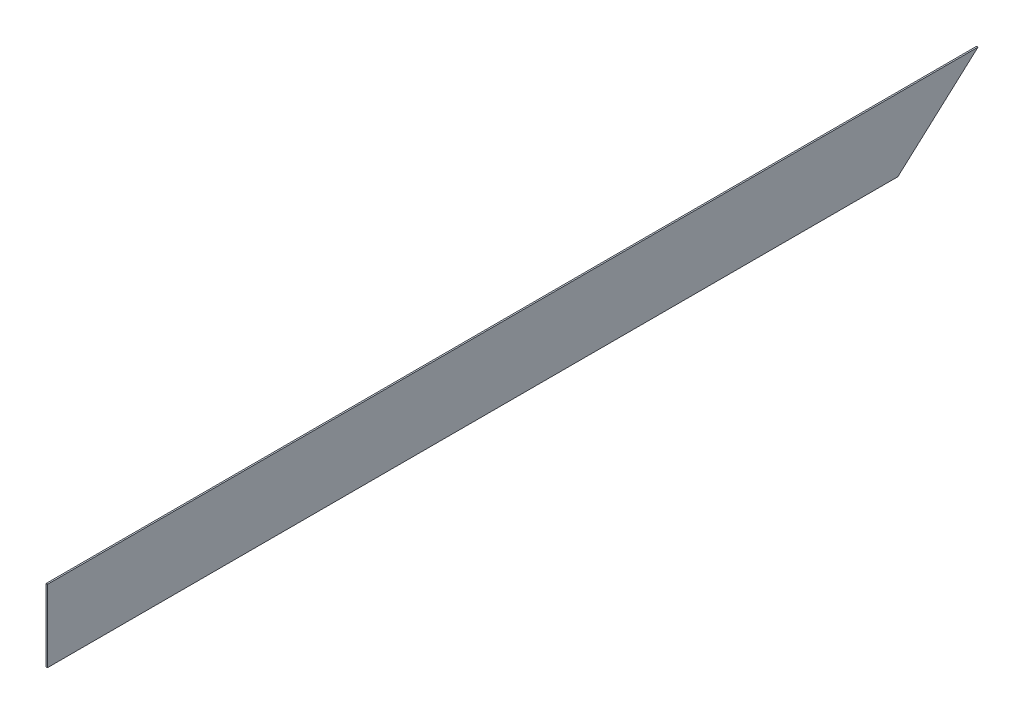
ISO-10303-21;
HEADER;
FILE_DESCRIPTION(('STEP AP214'),'2;1');
FILE_NAME('part.step','',(''),(''),'','','');
FILE_SCHEMA(('AUTOMOTIVE_DESIGN { 1 0 10303 214 1 1 1 1 }'));
ENDSEC;
DATA;
#1=APPLICATION_CONTEXT('core data for automotive mechanical design processes');
#2=APPLICATION_PROTOCOL_DEFINITION('international standard','automotive_design',2000,#1);
#3=PRODUCT_CONTEXT('',#1,'mechanical');
#4=PRODUCT('Part','Part','',(#3));
#5=PRODUCT_RELATED_PRODUCT_CATEGORY('part','',(#4));
#6=PRODUCT_DEFINITION_FORMATION('','',#4);
#7=PRODUCT_DEFINITION_CONTEXT('part definition',#1,'design');
#8=PRODUCT_DEFINITION('design','',#6,#7);
#9=PRODUCT_DEFINITION_SHAPE('','',#8);
#10=(LENGTH_UNIT() NAMED_UNIT(*) SI_UNIT(.MILLI.,.METRE.));
#11=(NAMED_UNIT(*) PLANE_ANGLE_UNIT() SI_UNIT($,.RADIAN.));
#12=(NAMED_UNIT(*) SI_UNIT($,.STERADIAN.) SOLID_ANGLE_UNIT());
#13=UNCERTAINTY_MEASURE_WITH_UNIT(LENGTH_MEASURE(1.E-05),#10,'distance_accuracy_value','');
#14=(GEOMETRIC_REPRESENTATION_CONTEXT(3) GLOBAL_UNCERTAINTY_ASSIGNED_CONTEXT((#13)) GLOBAL_UNIT_ASSIGNED_CONTEXT((#10,
#11,#12)) REPRESENTATION_CONTEXT('',''));
#15=CARTESIAN_POINT('',(0.,0.,0.));
#16=DIRECTION('',(0.,0.,1.));
#17=DIRECTION('',(1.,0.,0.));
#18=AXIS2_PLACEMENT_3D('',#15,#16,#17);
#19=CARTESIAN_POINT('',(669.,-986.,1896.));
#20=DIRECTION('',(-1.,0.,0.));
#21=DIRECTION('',(0.,0.,-1.));
#22=AXIS2_PLACEMENT_3D('',#19,#20,#21);
#23=PLANE('',#22);
#24=DIRECTION('',(0.,1.,0.));
#25=VECTOR('',#24,1.);
#26=CARTESIAN_POINT('',(669.,-1084.5,1896.));
#27=LINE('',#26,#25);
#28=CARTESIAN_POINT('',(669.,-1084.5,1896.));
#29=VERTEX_POINT('',#28);
#30=CARTESIAN_POINT('',(669.,-986.,1896.));
#31=VERTEX_POINT('',#30);
#32=EDGE_CURVE('E82',#29,#31,#27,.T.);
#33=ORIENTED_EDGE('',*,*,#32,.F.);
#34=DIRECTION('',(0.,0.,1.));
#35=VECTOR('',#34,1.);
#36=CARTESIAN_POINT('',(669.,-1084.5,736.));
#37=LINE('',#36,#35);
#38=CARTESIAN_POINT('',(669.,-1084.5,736.));
#39=VERTEX_POINT('',#38);
#40=EDGE_CURVE('E34',#39,#29,#37,.T.);
#41=ORIENTED_EDGE('',*,*,#40,.F.);
#42=DIRECTION('',(0.,-0.669130606358878,0.743144825477376));
#43=VECTOR('',#42,1.);
#44=CARTESIAN_POINT('',(669.,-986.,626.604667289));
#45=LINE('',#44,#43);
#46=CARTESIAN_POINT('',(669.,-986.,626.604667289));
#47=VERTEX_POINT('',#46);
#48=EDGE_CURVE('E43',#47,#39,#45,.T.);
#49=ORIENTED_EDGE('',*,*,#48,.F.);
#50=DIRECTION('',(0.,0.,-1.));
#51=VECTOR('',#50,1.);
#52=CARTESIAN_POINT('',(669.,-986.,1896.));
#53=LINE('',#52,#51);
#54=EDGE_CURVE('E26',#31,#47,#53,.T.);
#55=ORIENTED_EDGE('',*,*,#54,.F.);
#56=EDGE_LOOP('',(#33,#41,#49,#55));
#57=FACE_BOUND('',#56,.T.);
#58=ADVANCED_FACE('F17',(#57),#23,.F.);
#59=CARTESIAN_POINT('',(669.,-986.,1896.));
#60=DIRECTION('',(0.,1.,0.));
#61=DIRECTION('',(1.,0.,0.));
#62=AXIS2_PLACEMENT_3D('',#59,#60,#61);
#63=PLANE('',#62);
#64=DIRECTION('',(-1.,0.,0.));
#65=VECTOR('',#64,1.);
#66=CARTESIAN_POINT('',(669.,-986.,626.604667289));
#67=LINE('',#66,#65);
#68=CARTESIAN_POINT('',(667.,-986.,626.604667289));
#69=VERTEX_POINT('',#68);
#70=EDGE_CURVE('E11',#47,#69,#67,.T.);
#71=ORIENTED_EDGE('',*,*,#70,.T.);
#72=DIRECTION('',(0.,0.,-1.));
#73=VECTOR('',#72,1.);
#74=CARTESIAN_POINT('',(667.,-986.,1896.));
#75=LINE('',#74,#73);
#76=CARTESIAN_POINT('',(667.,-986.,1896.));
#77=VERTEX_POINT('',#76);
#78=EDGE_CURVE('E72',#77,#69,#75,.T.);
#79=ORIENTED_EDGE('',*,*,#78,.F.);
#80=DIRECTION('',(-1.,0.,0.));
#81=VECTOR('',#80,1.);
#82=CARTESIAN_POINT('',(669.,-986.,1896.));
#83=LINE('',#82,#81);
#84=EDGE_CURVE('E80',#31,#77,#83,.T.);
#85=ORIENTED_EDGE('',*,*,#84,.F.);
#86=ORIENTED_EDGE('',*,*,#54,.T.);
#87=EDGE_LOOP('',(#71,#79,#85,#86));
#88=FACE_BOUND('',#87,.T.);
#89=ADVANCED_FACE('F90',(#88),#63,.T.);
#90=CARTESIAN_POINT('',(669.,-1084.5,1896.));
#91=DIRECTION('',(0.,0.,1.));
#92=DIRECTION('',(-1.,0.,0.));
#93=AXIS2_PLACEMENT_3D('',#90,#91,#92);
#94=PLANE('',#93);
#95=ORIENTED_EDGE('',*,*,#84,.T.);
#96=DIRECTION('',(0.,1.,0.));
#97=VECTOR('',#96,1.);
#98=CARTESIAN_POINT('',(667.,-1084.5,1896.));
#99=LINE('',#98,#97);
#100=CARTESIAN_POINT('',(667.,-1084.5,1896.));
#101=VERTEX_POINT('',#100);
#102=EDGE_CURVE('E67',#101,#77,#99,.T.);
#103=ORIENTED_EDGE('',*,*,#102,.F.);
#104=DIRECTION('',(-1.,0.,0.));
#105=VECTOR('',#104,1.);
#106=CARTESIAN_POINT('',(669.,-1084.5,1896.));
#107=LINE('',#106,#105);
#108=EDGE_CURVE('E21',#29,#101,#107,.T.);
#109=ORIENTED_EDGE('',*,*,#108,.F.);
#110=ORIENTED_EDGE('',*,*,#32,.T.);
#111=EDGE_LOOP('',(#95,#103,#109,#110));
#112=FACE_BOUND('',#111,.T.);
#113=ADVANCED_FACE('F86',(#112),#94,.T.);
#114=CARTESIAN_POINT('',(669.,-1084.5,736.));
#115=DIRECTION('',(0.,-1.,0.));
#116=DIRECTION('',(0.,0.,-1.));
#117=AXIS2_PLACEMENT_3D('',#114,#115,#116);
#118=PLANE('',#117);
#119=ORIENTED_EDGE('',*,*,#108,.T.);
#120=DIRECTION('',(0.,0.,1.));
#121=VECTOR('',#120,1.);
#122=CARTESIAN_POINT('',(667.,-1084.5,736.));
#123=LINE('',#122,#121);
#124=CARTESIAN_POINT('',(667.,-1084.5,736.));
#125=VERTEX_POINT('',#124);
#126=EDGE_CURVE('E60',#125,#101,#123,.T.);
#127=ORIENTED_EDGE('',*,*,#126,.F.);
#128=DIRECTION('',(-1.,0.,0.));
#129=VECTOR('',#128,1.);
#130=CARTESIAN_POINT('',(669.,-1084.5,736.));
#131=LINE('',#130,#129);
#132=EDGE_CURVE('E61',#39,#125,#131,.T.);
#133=ORIENTED_EDGE('',*,*,#132,.F.);
#134=ORIENTED_EDGE('',*,*,#40,.T.);
#135=EDGE_LOOP('',(#119,#127,#133,#134));
#136=FACE_BOUND('',#135,.T.);
#137=ADVANCED_FACE('F19',(#136),#118,.T.);
#138=CARTESIAN_POINT('',(669.,-986.,626.604667289));
#139=DIRECTION('',(0.,-0.743144825477376,-0.669130606358878));
#140=DIRECTION('',(1.,0.,0.));
#141=AXIS2_PLACEMENT_3D('',#138,#139,#140);
#142=PLANE('',#141);
#143=ORIENTED_EDGE('',*,*,#132,.T.);
#144=DIRECTION('',(0.,-0.669130606358878,0.743144825477376));
#145=VECTOR('',#144,1.);
#146=CARTESIAN_POINT('',(667.,-986.,626.604667289));
#147=LINE('',#146,#145);
#148=EDGE_CURVE('E66',#69,#125,#147,.T.);
#149=ORIENTED_EDGE('',*,*,#148,.F.);
#150=ORIENTED_EDGE('',*,*,#70,.F.);
#151=ORIENTED_EDGE('',*,*,#48,.T.);
#152=EDGE_LOOP('',(#143,#149,#150,#151));
#153=FACE_BOUND('',#152,.T.);
#154=ADVANCED_FACE('F70',(#153),#142,.T.);
#155=CARTESIAN_POINT('',(667.,-986.,1896.));
#156=DIRECTION('',(-1.,0.,0.));
#157=DIRECTION('',(0.,0.,-1.));
#158=AXIS2_PLACEMENT_3D('',#155,#156,#157);
#159=PLANE('',#158);
#160=ORIENTED_EDGE('',*,*,#148,.T.);
#161=ORIENTED_EDGE('',*,*,#126,.T.);
#162=ORIENTED_EDGE('',*,*,#102,.T.);
#163=ORIENTED_EDGE('',*,*,#78,.T.);
#164=EDGE_LOOP('',(#160,#161,#162,#163));
#165=FACE_BOUND('',#164,.T.);
#166=ADVANCED_FACE('F71',(#165),#159,.T.);
#167=CLOSED_SHELL('',(#58,#89,#113,#137,#154,#166));
#168=MANIFOLD_SOLID_BREP('B1',#167);
#169=ADVANCED_BREP_SHAPE_REPRESENTATION('',(#18,#168),#14);
#170=SHAPE_DEFINITION_REPRESENTATION(#9,#169);
ENDSEC;
END-ISO-10303-21;
